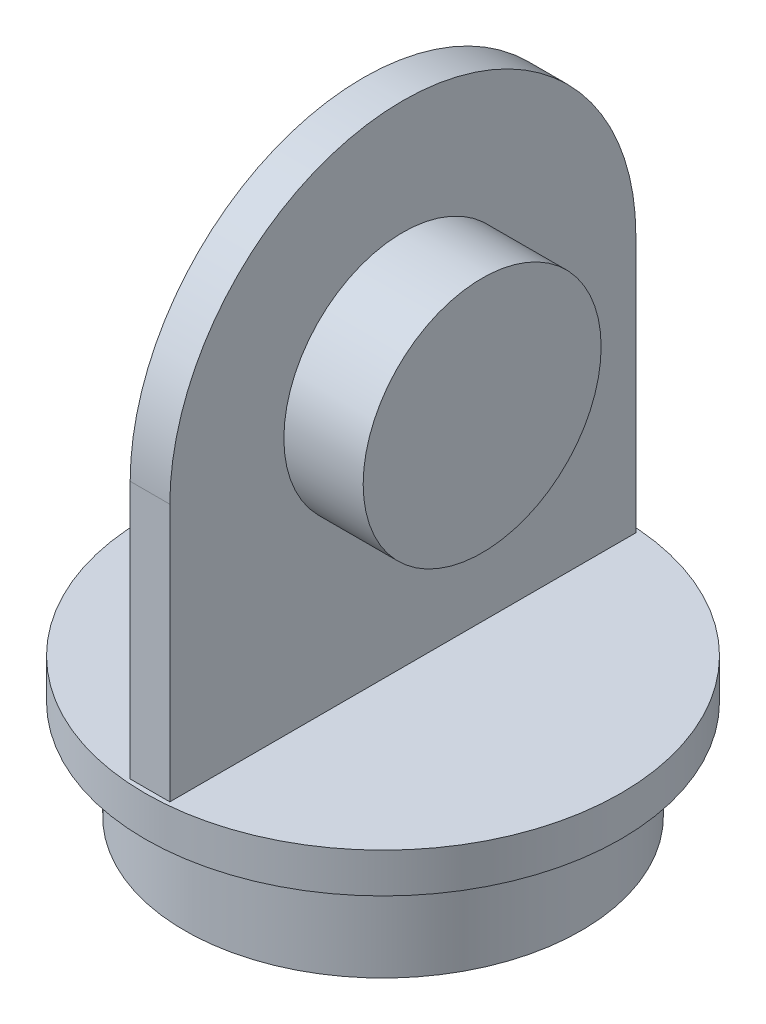
ISO-10303-21;
HEADER;
FILE_DESCRIPTION(('STEP AP214'),'2;1');
FILE_NAME('part.step','',(''),(''),'','','');
FILE_SCHEMA(('AUTOMOTIVE_DESIGN { 1 0 10303 214 1 1 1 1 }'));
ENDSEC;
DATA;
#1=APPLICATION_CONTEXT('core data for automotive mechanical design processes');
#2=APPLICATION_PROTOCOL_DEFINITION('international standard','automotive_design',2000,#1);
#3=PRODUCT_CONTEXT('',#1,'mechanical');
#4=PRODUCT('Part','Part','',(#3));
#5=PRODUCT_RELATED_PRODUCT_CATEGORY('part','',(#4));
#6=PRODUCT_DEFINITION_FORMATION('','',#4);
#7=PRODUCT_DEFINITION_CONTEXT('part definition',#1,'design');
#8=PRODUCT_DEFINITION('design','',#6,#7);
#9=PRODUCT_DEFINITION_SHAPE('','',#8);
#10=(LENGTH_UNIT() NAMED_UNIT(*) SI_UNIT(.MILLI.,.METRE.));
#11=(NAMED_UNIT(*) PLANE_ANGLE_UNIT() SI_UNIT($,.RADIAN.));
#12=(NAMED_UNIT(*) SI_UNIT($,.STERADIAN.) SOLID_ANGLE_UNIT());
#13=UNCERTAINTY_MEASURE_WITH_UNIT(LENGTH_MEASURE(1.E-05),#10,'distance_accuracy_value','');
#14=(GEOMETRIC_REPRESENTATION_CONTEXT(3) GLOBAL_UNCERTAINTY_ASSIGNED_CONTEXT((#13)) GLOBAL_UNIT_ASSIGNED_CONTEXT((#10,
#11,#12)) REPRESENTATION_CONTEXT('',''));
#15=CARTESIAN_POINT('',(0.,0.,0.));
#16=DIRECTION('',(0.,0.,1.));
#17=DIRECTION('',(1.,0.,0.));
#18=AXIS2_PLACEMENT_3D('',#15,#16,#17);
#19=CARTESIAN_POINT('',(0.,-1.51672175386197,0.));
#20=DIRECTION('',(0.,1.,0.));
#21=DIRECTION('',(0.,0.,1.));
#22=AXIS2_PLACEMENT_3D('',#19,#20,#21);
#23=PLANE('',#22);
#24=CARTESIAN_POINT('',(0.,-1.51672175386197,0.));
#25=DIRECTION('',(0.,1.,0.));
#26=DIRECTION('',(0.,0.,1.));
#27=AXIS2_PLACEMENT_3D('',#24,#25,#26);
#28=CIRCLE('',#27,24.);
#29=CARTESIAN_POINT('',(0.,-1.51672175386197,24.));
#30=VERTEX_POINT('',#29);
#31=EDGE_CURVE('E123',#30,#30,#28,.T.);
#32=ORIENTED_EDGE('',*,*,#31,.T.);
#33=EDGE_LOOP('',(#32));
#34=FACE_BOUND('',#33,.T.);
#35=DIRECTION('',(-1.,0.,0.));
#36=VECTOR('',#35,1.);
#37=CARTESIAN_POINT('',(2.,-1.51672175386197,23.5));
#38=LINE('',#37,#36);
#39=CARTESIAN_POINT('',(2.,-1.51672175386197,23.5));
#40=VERTEX_POINT('',#39);
#41=CARTESIAN_POINT('',(-2.,-1.51672175386197,23.5));
#42=VERTEX_POINT('',#41);
#43=EDGE_CURVE('E108',#40,#42,#38,.T.);
#44=ORIENTED_EDGE('',*,*,#43,.T.);
#45=DIRECTION('',(0.,0.,-1.));
#46=VECTOR('',#45,1.);
#47=CARTESIAN_POINT('',(-2.,-1.51672175386197,23.5));
#48=LINE('',#47,#46);
#49=CARTESIAN_POINT('',(-2.,-1.51672175386197,-23.5));
#50=VERTEX_POINT('',#49);
#51=EDGE_CURVE('E58',#42,#50,#48,.T.);
#52=ORIENTED_EDGE('',*,*,#51,.T.);
#53=DIRECTION('',(-1.,0.,0.));
#54=VECTOR('',#53,1.);
#55=CARTESIAN_POINT('',(2.,-1.51672175386197,-23.5));
#56=LINE('',#55,#54);
#57=CARTESIAN_POINT('',(2.,-1.51672175386197,-23.5));
#58=VERTEX_POINT('',#57);
#59=EDGE_CURVE('E103',#58,#50,#56,.T.);
#60=ORIENTED_EDGE('',*,*,#59,.F.);
#61=DIRECTION('',(0.,0.,-1.));
#62=VECTOR('',#61,1.);
#63=CARTESIAN_POINT('',(2.,-1.51672175386197,23.5));
#64=LINE('',#63,#62);
#65=EDGE_CURVE('E97',#40,#58,#64,.T.);
#66=ORIENTED_EDGE('',*,*,#65,.F.);
#67=EDGE_LOOP('',(#44,#52,#60,#66));
#68=FACE_BOUND('',#67,.T.);
#69=ADVANCED_FACE('F41',(#34,#68),#23,.T.);
#70=CARTESIAN_POINT('',(0.,-1.51672175386197,0.));
#71=DIRECTION('',(0.,-1.,0.));
#72=DIRECTION('',(0.,0.,-1.));
#73=AXIS2_PLACEMENT_3D('',#70,#71,#72);
#74=CYLINDRICAL_SURFACE('',#73,24.);
#75=ORIENTED_EDGE('',*,*,#31,.F.);
#76=EDGE_LOOP('',(#75));
#77=FACE_BOUND('',#76,.T.);
#78=CARTESIAN_POINT('',(0.,-5.51672175386197,0.));
#79=DIRECTION('',(0.,1.,0.));
#80=DIRECTION('',(0.,0.,1.));
#81=AXIS2_PLACEMENT_3D('',#78,#79,#80);
#82=CIRCLE('',#81,24.);
#83=CARTESIAN_POINT('',(0.,-5.51672175386197,24.));
#84=VERTEX_POINT('',#83);
#85=EDGE_CURVE('E122',#84,#84,#82,.T.);
#86=ORIENTED_EDGE('',*,*,#85,.T.);
#87=EDGE_LOOP('',(#86));
#88=FACE_BOUND('',#87,.T.);
#89=ADVANCED_FACE('F43',(#77,#88),#74,.T.);
#90=CARTESIAN_POINT('',(0.,-5.51672175386197,0.));
#91=DIRECTION('',(0.,1.,0.));
#92=DIRECTION('',(0.,0.,1.));
#93=AXIS2_PLACEMENT_3D('',#90,#91,#92);
#94=PLANE('',#93);
#95=CARTESIAN_POINT('',(0.,-5.51672175386197,0.));
#96=DIRECTION('',(0.,-1.,0.));
#97=DIRECTION('',(0.,0.,-1.));
#98=AXIS2_PLACEMENT_3D('',#95,#96,#97);
#99=CIRCLE('',#98,20.);
#100=CARTESIAN_POINT('',(0.,-5.51672175386197,-20.));
#101=VERTEX_POINT('',#100);
#102=EDGE_CURVE('E50',#101,#101,#99,.T.);
#103=ORIENTED_EDGE('',*,*,#102,.F.);
#104=EDGE_LOOP('',(#103));
#105=FACE_BOUND('',#104,.T.);
#106=ORIENTED_EDGE('',*,*,#85,.F.);
#107=EDGE_LOOP('',(#106));
#108=FACE_BOUND('',#107,.T.);
#109=ADVANCED_FACE('F129',(#105,#108),#94,.F.);
#110=CARTESIAN_POINT('',(2.,24.483278246138,-23.5));
#111=DIRECTION('',(0.,0.,1.));
#112=DIRECTION('',(0.,-1.,0.));
#113=AXIS2_PLACEMENT_3D('',#110,#111,#112);
#114=PLANE('',#113);
#115=DIRECTION('',(0.,1.,0.));
#116=VECTOR('',#115,1.);
#117=CARTESIAN_POINT('',(-2.,24.483278246138,-23.5));
#118=LINE('',#117,#116);
#119=CARTESIAN_POINT('',(-2.,24.483278246138,-23.5));
#120=VERTEX_POINT('',#119);
#121=EDGE_CURVE('E102',#50,#120,#118,.T.);
#122=ORIENTED_EDGE('',*,*,#121,.T.);
#123=DIRECTION('',(-1.,0.,0.));
#124=VECTOR('',#123,1.);
#125=CARTESIAN_POINT('',(2.,24.483278246138,-23.5));
#126=LINE('',#125,#124);
#127=CARTESIAN_POINT('',(2.,24.483278246138,-23.5));
#128=VERTEX_POINT('',#127);
#129=EDGE_CURVE('E100',#128,#120,#126,.T.);
#130=ORIENTED_EDGE('',*,*,#129,.F.);
#131=DIRECTION('',(0.,1.,0.));
#132=VECTOR('',#131,1.);
#133=CARTESIAN_POINT('',(2.,24.483278246138,-23.5));
#134=LINE('',#133,#132);
#135=EDGE_CURVE('E92',#58,#128,#134,.T.);
#136=ORIENTED_EDGE('',*,*,#135,.F.);
#137=ORIENTED_EDGE('',*,*,#59,.T.);
#138=EDGE_LOOP('',(#122,#130,#136,#137));
#139=FACE_BOUND('',#138,.T.);
#140=ADVANCED_FACE('F101',(#139),#114,.F.);
#141=CARTESIAN_POINT('',(2.,24.483278246138,0.));
#142=DIRECTION('',(-1.,0.,0.));
#143=DIRECTION('',(0.,0.,1.));
#144=AXIS2_PLACEMENT_3D('',#141,#142,#143);
#145=CYLINDRICAL_SURFACE('',#144,23.5);
#146=CARTESIAN_POINT('',(-2.,24.483278246138,0.));
#147=DIRECTION('',(1.,0.,0.));
#148=DIRECTION('',(0.,0.,1.));
#149=AXIS2_PLACEMENT_3D('',#146,#147,#148);
#150=CIRCLE('',#149,23.5);
#151=CARTESIAN_POINT('',(-2.,24.483278246138,23.5));
#152=VERTEX_POINT('',#151);
#153=EDGE_CURVE('E84',#120,#152,#150,.T.);
#154=ORIENTED_EDGE('',*,*,#153,.T.);
#155=DIRECTION('',(-1.,0.,0.));
#156=VECTOR('',#155,1.);
#157=CARTESIAN_POINT('',(2.,24.483278246138,23.5));
#158=LINE('',#157,#156);
#159=CARTESIAN_POINT('',(2.,24.483278246138,23.5));
#160=VERTEX_POINT('',#159);
#161=EDGE_CURVE('E104',#160,#152,#158,.T.);
#162=ORIENTED_EDGE('',*,*,#161,.F.);
#163=CARTESIAN_POINT('',(2.,24.483278246138,0.));
#164=DIRECTION('',(1.,0.,0.));
#165=DIRECTION('',(0.,0.,1.));
#166=AXIS2_PLACEMENT_3D('',#163,#164,#165);
#167=CIRCLE('',#166,23.5);
#168=EDGE_CURVE('E95',#128,#160,#167,.T.);
#169=ORIENTED_EDGE('',*,*,#168,.F.);
#170=ORIENTED_EDGE('',*,*,#129,.T.);
#171=EDGE_LOOP('',(#154,#162,#169,#170));
#172=FACE_BOUND('',#171,.T.);
#173=ADVANCED_FACE('F106',(#172),#145,.T.);
#174=CARTESIAN_POINT('',(2.,-1.51672175386197,23.5));
#175=DIRECTION('',(0.,0.,-1.));
#176=DIRECTION('',(0.,1.,0.));
#177=AXIS2_PLACEMENT_3D('',#174,#175,#176);
#178=PLANE('',#177);
#179=DIRECTION('',(0.,-1.,0.));
#180=VECTOR('',#179,1.);
#181=CARTESIAN_POINT('',(-2.,-1.51672175386197,23.5));
#182=LINE('',#181,#180);
#183=EDGE_CURVE('E116',#152,#42,#182,.T.);
#184=ORIENTED_EDGE('',*,*,#183,.T.);
#185=ORIENTED_EDGE('',*,*,#43,.F.);
#186=DIRECTION('',(0.,-1.,0.));
#187=VECTOR('',#186,1.);
#188=CARTESIAN_POINT('',(2.,-1.51672175386197,23.5));
#189=LINE('',#188,#187);
#190=EDGE_CURVE('E67',#160,#40,#189,.T.);
#191=ORIENTED_EDGE('',*,*,#190,.F.);
#192=ORIENTED_EDGE('',*,*,#161,.T.);
#193=EDGE_LOOP('',(#184,#185,#191,#192));
#194=FACE_BOUND('',#193,.T.);
#195=ADVANCED_FACE('F148',(#194),#178,.F.);
#196=CARTESIAN_POINT('',(2.,24.483278246138,0.));
#197=DIRECTION('',(-1.,0.,0.));
#198=DIRECTION('',(0.,0.,1.));
#199=AXIS2_PLACEMENT_3D('',#196,#197,#198);
#200=PLANE('',#199);
#201=CARTESIAN_POINT('',(2.,24.483278246138,0.));
#202=DIRECTION('',(-1.,0.,0.));
#203=DIRECTION('',(0.,0.,1.));
#204=AXIS2_PLACEMENT_3D('',#201,#202,#203);
#205=CIRCLE('',#204,12.);
#206=CARTESIAN_POINT('',(2.,24.483278246138,12.));
#207=VERTEX_POINT('',#206);
#208=EDGE_CURVE('E11',#207,#207,#205,.F.);
#209=ORIENTED_EDGE('',*,*,#208,.F.);
#210=EDGE_LOOP('',(#209));
#211=FACE_BOUND('',#210,.T.);
#212=ORIENTED_EDGE('',*,*,#65,.T.);
#213=ORIENTED_EDGE('',*,*,#135,.T.);
#214=ORIENTED_EDGE('',*,*,#168,.T.);
#215=ORIENTED_EDGE('',*,*,#190,.T.);
#216=EDGE_LOOP('',(#212,#213,#214,#215));
#217=FACE_BOUND('',#216,.T.);
#218=ADVANCED_FACE('F93',(#211,#217),#200,.F.);
#219=CARTESIAN_POINT('',(-2.,24.483278246138,0.));
#220=DIRECTION('',(-1.,0.,0.));
#221=DIRECTION('',(0.,0.,1.));
#222=AXIS2_PLACEMENT_3D('',#219,#220,#221);
#223=PLANE('',#222);
#224=CARTESIAN_POINT('',(-2.,24.483278246138,0.));
#225=DIRECTION('',(-1.,0.,0.));
#226=DIRECTION('',(0.,0.,1.));
#227=AXIS2_PLACEMENT_3D('',#224,#225,#226);
#228=CIRCLE('',#227,12.);
#229=CARTESIAN_POINT('',(-2.,24.483278246138,12.));
#230=VERTEX_POINT('',#229);
#231=EDGE_CURVE('E45',#230,#230,#228,.F.);
#232=ORIENTED_EDGE('',*,*,#231,.T.);
#233=EDGE_LOOP('',(#232));
#234=FACE_BOUND('',#233,.T.);
#235=ORIENTED_EDGE('',*,*,#51,.F.);
#236=ORIENTED_EDGE('',*,*,#183,.F.);
#237=ORIENTED_EDGE('',*,*,#153,.F.);
#238=ORIENTED_EDGE('',*,*,#121,.F.);
#239=EDGE_LOOP('',(#235,#236,#237,#238));
#240=FACE_BOUND('',#239,.T.);
#241=ADVANCED_FACE('F152',(#234,#240),#223,.T.);
#242=CARTESIAN_POINT('',(0.,-15.516721753862,0.));
#243=DIRECTION('',(0.,1.,0.));
#244=DIRECTION('',(0.,0.,1.));
#245=AXIS2_PLACEMENT_3D('',#242,#243,#244);
#246=CYLINDRICAL_SURFACE('',#245,20.);
#247=CARTESIAN_POINT('',(0.,-15.516721753862,0.));
#248=DIRECTION('',(0.,-1.,0.));
#249=DIRECTION('',(0.,0.,-1.));
#250=AXIS2_PLACEMENT_3D('',#247,#248,#249);
#251=CIRCLE('',#250,20.);
#252=CARTESIAN_POINT('',(0.,-15.516721753862,-20.));
#253=VERTEX_POINT('',#252);
#254=EDGE_CURVE('E113',#253,#253,#251,.T.);
#255=ORIENTED_EDGE('',*,*,#254,.F.);
#256=EDGE_LOOP('',(#255));
#257=FACE_BOUND('',#256,.T.);
#258=ORIENTED_EDGE('',*,*,#102,.T.);
#259=EDGE_LOOP('',(#258));
#260=FACE_BOUND('',#259,.T.);
#261=ADVANCED_FACE('F155',(#257,#260),#246,.T.);
#262=CARTESIAN_POINT('',(0.,-15.516721753862,0.));
#263=DIRECTION('',(0.,-1.,0.));
#264=DIRECTION('',(0.,0.,-1.));
#265=AXIS2_PLACEMENT_3D('',#262,#263,#264);
#266=PLANE('',#265);
#267=ORIENTED_EDGE('',*,*,#254,.T.);
#268=EDGE_LOOP('',(#267));
#269=FACE_BOUND('',#268,.T.);
#270=ADVANCED_FACE('F162',(#269),#266,.T.);
#271=CARTESIAN_POINT('',(-10.,24.483278246138,0.));
#272=DIRECTION('',(1.,0.,0.));
#273=DIRECTION('',(0.,0.,-1.));
#274=AXIS2_PLACEMENT_3D('',#271,#272,#273);
#275=PLANE('',#274);
#276=CARTESIAN_POINT('',(-10.,24.483278246138,0.));
#277=DIRECTION('',(1.,0.,0.));
#278=DIRECTION('',(0.,0.,-1.));
#279=AXIS2_PLACEMENT_3D('',#276,#277,#278);
#280=CIRCLE('',#279,12.);
#281=CARTESIAN_POINT('',(-10.,24.483278246138,-12.));
#282=VERTEX_POINT('',#281);
#283=EDGE_CURVE('E186',#282,#282,#280,.T.);
#284=ORIENTED_EDGE('',*,*,#283,.F.);
#285=EDGE_LOOP('',(#284));
#286=FACE_BOUND('',#285,.T.);
#287=ADVANCED_FACE('F166',(#286),#275,.F.);
#288=CARTESIAN_POINT('',(10.,24.483278246138,0.));
#289=DIRECTION('',(-1.,0.,0.));
#290=DIRECTION('',(0.,0.,1.));
#291=AXIS2_PLACEMENT_3D('',#288,#289,#290);
#292=CYLINDRICAL_SURFACE('',#291,12.);
#293=ORIENTED_EDGE('',*,*,#231,.F.);
#294=EDGE_LOOP('',(#293));
#295=FACE_BOUND('',#294,.T.);
#296=ORIENTED_EDGE('',*,*,#283,.T.);
#297=EDGE_LOOP('',(#296));
#298=FACE_BOUND('',#297,.T.);
#299=ADVANCED_FACE('F168',(#295,#298),#292,.T.);
#300=CARTESIAN_POINT('',(10.,24.483278246138,0.));
#301=DIRECTION('',(1.,0.,0.));
#302=DIRECTION('',(0.,0.,-1.));
#303=AXIS2_PLACEMENT_3D('',#300,#301,#302);
#304=CIRCLE('',#303,12.);
#305=CARTESIAN_POINT('',(10.,24.483278246138,-12.));
#306=VERTEX_POINT('',#305);
#307=EDGE_CURVE('E185',#306,#306,#304,.T.);
#308=ORIENTED_EDGE('',*,*,#307,.F.);
#309=EDGE_LOOP('',(#308));
#310=FACE_BOUND('',#309,.T.);
#311=ORIENTED_EDGE('',*,*,#208,.T.);
#312=EDGE_LOOP('',(#311));
#313=FACE_BOUND('',#312,.T.);
#314=ADVANCED_FACE('F171',(#310,#313),#292,.T.);
#315=CARTESIAN_POINT('',(10.,24.483278246138,0.));
#316=DIRECTION('',(1.,0.,0.));
#317=DIRECTION('',(0.,0.,-1.));
#318=AXIS2_PLACEMENT_3D('',#315,#316,#317);
#319=PLANE('',#318);
#320=ORIENTED_EDGE('',*,*,#307,.T.);
#321=EDGE_LOOP('',(#320));
#322=FACE_BOUND('',#321,.T.);
#323=ADVANCED_FACE('F176',(#322),#319,.T.);
#324=CLOSED_SHELL('',(#69,#89,#109,#140,#173,#195,#218,#241,#261,#270,#287,#299,#314,#323));
#325=MANIFOLD_SOLID_BREP('B2',#324);
#326=ADVANCED_BREP_SHAPE_REPRESENTATION('',(#18,#325),#14);
#327=SHAPE_DEFINITION_REPRESENTATION(#9,#326);
ENDSEC;
END-ISO-10303-21;
